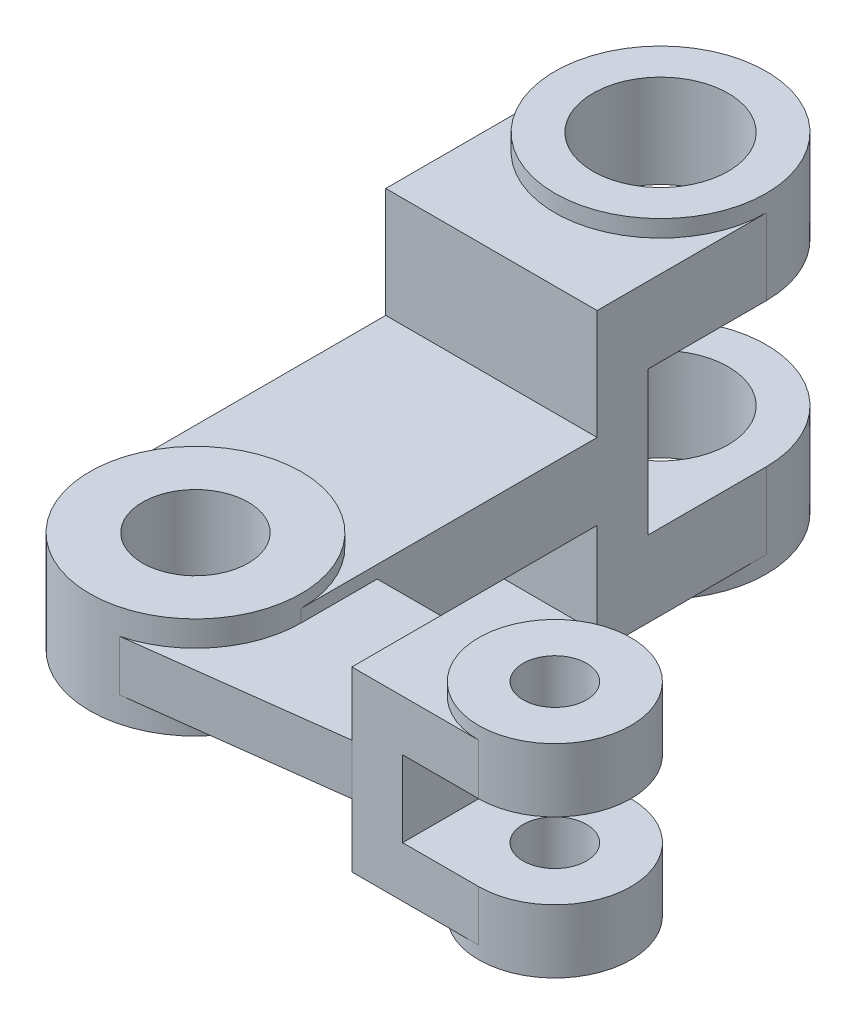
ISO-10303-21;
HEADER;
FILE_DESCRIPTION(('STEP AP214'),'2;1');
FILE_NAME('part.step','',(''),(''),'','','');
FILE_SCHEMA(('AUTOMOTIVE_DESIGN { 1 0 10303 214 1 1 1 1 }'));
ENDSEC;
DATA;
#1=APPLICATION_CONTEXT('core data for automotive mechanical design processes');
#2=APPLICATION_PROTOCOL_DEFINITION('international standard','automotive_design',2000,#1);
#3=PRODUCT_CONTEXT('',#1,'mechanical');
#4=PRODUCT('Part','Part','',(#3));
#5=PRODUCT_RELATED_PRODUCT_CATEGORY('part','',(#4));
#6=PRODUCT_DEFINITION_FORMATION('','',#4);
#7=PRODUCT_DEFINITION_CONTEXT('part definition',#1,'design');
#8=PRODUCT_DEFINITION('design','',#6,#7);
#9=PRODUCT_DEFINITION_SHAPE('','',#8);
#10=(LENGTH_UNIT() NAMED_UNIT(*) SI_UNIT(.MILLI.,.METRE.));
#11=(NAMED_UNIT(*) PLANE_ANGLE_UNIT() SI_UNIT($,.RADIAN.));
#12=(NAMED_UNIT(*) SI_UNIT($,.STERADIAN.) SOLID_ANGLE_UNIT());
#13=UNCERTAINTY_MEASURE_WITH_UNIT(LENGTH_MEASURE(1.E-05),#10,'distance_accuracy_value','');
#14=(GEOMETRIC_REPRESENTATION_CONTEXT(3) GLOBAL_UNCERTAINTY_ASSIGNED_CONTEXT((#13)) GLOBAL_UNIT_ASSIGNED_CONTEXT((#10,
#11,#12)) REPRESENTATION_CONTEXT('',''));
#15=CARTESIAN_POINT('',(0.,0.,0.));
#16=DIRECTION('',(0.,0.,1.));
#17=DIRECTION('',(1.,0.,0.));
#18=AXIS2_PLACEMENT_3D('',#15,#16,#17);
#19=CARTESIAN_POINT('',(25.,35.,40.));
#20=DIRECTION('',(0.,0.,-1.));
#21=DIRECTION('',(-1.,0.,0.));
#22=AXIS2_PLACEMENT_3D('',#19,#20,#21);
#23=PLANE('',#22);
#24=DIRECTION('',(-1.,0.,0.));
#25=VECTOR('',#24,1.);
#26=CARTESIAN_POINT('',(25.,9.,40.));
#27=LINE('',#26,#25);
#28=CARTESIAN_POINT('',(25.,9.,40.));
#29=VERTEX_POINT('',#28);
#30=CARTESIAN_POINT('',(-25.,9.,40.));
#31=VERTEX_POINT('',#30);
#32=EDGE_CURVE('E309',#29,#31,#27,.T.);
#33=ORIENTED_EDGE('',*,*,#32,.F.);
#34=DIRECTION('',(0.,-1.,0.));
#35=VECTOR('',#34,1.);
#36=CARTESIAN_POINT('',(25.,35.,40.));
#37=LINE('',#36,#35);
#38=CARTESIAN_POINT('',(25.,35.,40.));
#39=VERTEX_POINT('',#38);
#40=EDGE_CURVE('E386',#39,#29,#37,.T.);
#41=ORIENTED_EDGE('',*,*,#40,.F.);
#42=DIRECTION('',(1.,0.,0.));
#43=VECTOR('',#42,1.);
#44=CARTESIAN_POINT('',(25.,35.,40.));
#45=LINE('',#44,#43);
#46=CARTESIAN_POINT('',(-25.,35.,40.));
#47=VERTEX_POINT('',#46);
#48=EDGE_CURVE('E368',#47,#39,#45,.T.);
#49=ORIENTED_EDGE('',*,*,#48,.F.);
#50=DIRECTION('',(0.,-1.,0.));
#51=VECTOR('',#50,1.);
#52=CARTESIAN_POINT('',(-25.,35.,40.));
#53=LINE('',#52,#51);
#54=EDGE_CURVE('E390',#47,#31,#53,.T.);
#55=ORIENTED_EDGE('',*,*,#54,.T.);
#56=EDGE_LOOP('',(#33,#41,#49,#55));
#57=FACE_BOUND('',#56,.T.);
#58=ADVANCED_FACE('F39',(#57),#23,.F.);
#59=CARTESIAN_POINT('',(0.,35.,0.));
#60=DIRECTION('',(0.,-1.,0.));
#61=DIRECTION('',(0.,0.,-1.));
#62=AXIS2_PLACEMENT_3D('',#59,#60,#61);
#63=CYLINDRICAL_SURFACE('',#62,25.);
#64=CARTESIAN_POINT('',(0.,-17.,0.));
#65=DIRECTION('',(0.,-1.,0.));
#66=DIRECTION('',(0.,0.,-1.));
#67=AXIS2_PLACEMENT_3D('',#64,#65,#66);
#68=CIRCLE('',#67,25.);
#69=CARTESIAN_POINT('',(-25.,-17.,0.));
#70=VERTEX_POINT('',#69);
#71=CARTESIAN_POINT('',(25.,-17.,0.));
#72=VERTEX_POINT('',#71);
#73=EDGE_CURVE('E363',#70,#72,#68,.T.);
#74=ORIENTED_EDGE('',*,*,#73,.T.);
#75=DIRECTION('',(0.,-1.,0.));
#76=VECTOR('',#75,1.);
#77=CARTESIAN_POINT('',(25.,35.,0.));
#78=LINE('',#77,#76);
#79=CARTESIAN_POINT('',(25.,-35.,0.));
#80=VERTEX_POINT('',#79);
#81=EDGE_CURVE('E374',#72,#80,#78,.T.);
#82=ORIENTED_EDGE('',*,*,#81,.T.);
#83=CARTESIAN_POINT('',(0.,-35.,0.));
#84=DIRECTION('',(0.,1.,0.));
#85=DIRECTION('',(0.,0.,1.));
#86=AXIS2_PLACEMENT_3D('',#83,#84,#85);
#87=CIRCLE('',#86,25.);
#88=CARTESIAN_POINT('',(-25.,-35.,0.));
#89=VERTEX_POINT('',#88);
#90=EDGE_CURVE('E11',#89,#80,#87,.T.);
#91=ORIENTED_EDGE('',*,*,#90,.F.);
#92=DIRECTION('',(0.,-1.,0.));
#93=VECTOR('',#92,1.);
#94=CARTESIAN_POINT('',(-25.,35.,0.));
#95=LINE('',#94,#93);
#96=EDGE_CURVE('E391',#70,#89,#95,.T.);
#97=ORIENTED_EDGE('',*,*,#96,.F.);
#98=EDGE_LOOP('',(#74,#82,#91,#97));
#99=FACE_BOUND('',#98,.T.);
#100=CARTESIAN_POINT('',(0.,-39.,0.));
#101=DIRECTION('',(0.,1.,0.));
#102=DIRECTION('',(0.,0.,1.));
#103=AXIS2_PLACEMENT_3D('',#100,#101,#102);
#104=CIRCLE('',#103,25.);
#105=CARTESIAN_POINT('',(0.,-39.,25.));
#106=VERTEX_POINT('',#105);
#107=EDGE_CURVE('E330',#106,#106,#104,.T.);
#108=ORIENTED_EDGE('',*,*,#107,.T.);
#109=EDGE_LOOP('',(#108));
#110=FACE_BOUND('',#109,.T.);
#111=ADVANCED_FACE('F448',(#99,#110),#63,.T.);
#112=CARTESIAN_POINT('',(25.,35.,0.));
#113=VERTEX_POINT('',#112);
#114=CARTESIAN_POINT('',(25.,17.,0.));
#115=VERTEX_POINT('',#114);
#116=EDGE_CURVE('E382',#113,#115,#78,.T.);
#117=ORIENTED_EDGE('',*,*,#116,.T.);
#118=CARTESIAN_POINT('',(0.,17.,0.));
#119=DIRECTION('',(0.,1.,0.));
#120=DIRECTION('',(0.,0.,1.));
#121=AXIS2_PLACEMENT_3D('',#118,#119,#120);
#122=CIRCLE('',#121,25.);
#123=CARTESIAN_POINT('',(-25.,17.,0.));
#124=VERTEX_POINT('',#123);
#125=EDGE_CURVE('E359',#115,#124,#122,.T.);
#126=ORIENTED_EDGE('',*,*,#125,.T.);
#127=CARTESIAN_POINT('',(-25.,35.,0.));
#128=VERTEX_POINT('',#127);
#129=EDGE_CURVE('E392',#128,#124,#95,.T.);
#130=ORIENTED_EDGE('',*,*,#129,.F.);
#131=CARTESIAN_POINT('',(0.,35.,0.));
#132=DIRECTION('',(0.,1.,0.));
#133=DIRECTION('',(0.,0.,1.));
#134=AXIS2_PLACEMENT_3D('',#131,#132,#133);
#135=CIRCLE('',#134,25.);
#136=EDGE_CURVE('E48',#128,#113,#135,.T.);
#137=ORIENTED_EDGE('',*,*,#136,.T.);
#138=EDGE_LOOP('',(#117,#126,#130,#137));
#139=FACE_BOUND('',#138,.T.);
#140=CARTESIAN_POINT('',(0.,39.,0.));
#141=DIRECTION('',(0.,1.,0.));
#142=DIRECTION('',(0.,0.,1.));
#143=AXIS2_PLACEMENT_3D('',#140,#141,#142);
#144=CIRCLE('',#143,25.);
#145=CARTESIAN_POINT('',(0.,39.,25.));
#146=VERTEX_POINT('',#145);
#147=EDGE_CURVE('E336',#146,#146,#144,.T.);
#148=ORIENTED_EDGE('',*,*,#147,.F.);
#149=EDGE_LOOP('',(#148));
#150=FACE_BOUND('',#149,.T.);
#151=ADVANCED_FACE('F41',(#139,#150),#63,.T.);
#152=CARTESIAN_POINT('',(-25.,35.,40.));
#153=DIRECTION('',(1.,0.,0.));
#154=DIRECTION('',(0.,0.,-1.));
#155=AXIS2_PLACEMENT_3D('',#152,#153,#154);
#156=PLANE('',#155);
#157=DIRECTION('',(0.,-1.,0.));
#158=VECTOR('',#157,1.);
#159=CARTESIAN_POINT('',(-25.,-17.,28.));
#160=LINE('',#159,#158);
#161=CARTESIAN_POINT('',(-25.,17.,28.));
#162=VERTEX_POINT('',#161);
#163=CARTESIAN_POINT('',(-25.,-17.,28.));
#164=VERTEX_POINT('',#163);
#165=EDGE_CURVE('E350',#162,#164,#160,.T.);
#166=ORIENTED_EDGE('',*,*,#165,.T.);
#167=DIRECTION('',(0.,0.,-1.));
#168=VECTOR('',#167,1.);
#169=CARTESIAN_POINT('',(-25.,-17.,-25.));
#170=LINE('',#169,#168);
#171=EDGE_CURVE('E353',#164,#70,#170,.T.);
#172=ORIENTED_EDGE('',*,*,#171,.T.);
#173=ORIENTED_EDGE('',*,*,#96,.T.);
#174=DIRECTION('',(0.,0.,1.));
#175=VECTOR('',#174,1.);
#176=CARTESIAN_POINT('',(-25.,-35.,40.));
#177=LINE('',#176,#175);
#178=CARTESIAN_POINT('',(-25.,-35.,40.));
#179=VERTEX_POINT('',#178);
#180=EDGE_CURVE('E365',#89,#179,#177,.T.);
#181=ORIENTED_EDGE('',*,*,#180,.T.);
#182=CARTESIAN_POINT('',(-25.,-9.,40.));
#183=VERTEX_POINT('',#182);
#184=EDGE_CURVE('E389',#183,#179,#53,.T.);
#185=ORIENTED_EDGE('',*,*,#184,.F.);
#186=DIRECTION('',(0.,0.,1.));
#187=VECTOR('',#186,1.);
#188=CARTESIAN_POINT('',(-25.,-9.,40.));
#189=LINE('',#188,#187);
#190=CARTESIAN_POINT('',(-25.,-9.,110.));
#191=VERTEX_POINT('',#190);
#192=EDGE_CURVE('E310',#183,#191,#189,.T.);
#193=ORIENTED_EDGE('',*,*,#192,.T.);
#194=DIRECTION('',(0.,-1.,0.));
#195=VECTOR('',#194,1.);
#196=CARTESIAN_POINT('',(-25.,9.,110.));
#197=LINE('',#196,#195);
#198=CARTESIAN_POINT('',(-25.,9.,110.));
#199=VERTEX_POINT('',#198);
#200=EDGE_CURVE('E324',#199,#191,#197,.T.);
#201=ORIENTED_EDGE('',*,*,#200,.F.);
#202=DIRECTION('',(0.,0.,1.));
#203=VECTOR('',#202,1.);
#204=CARTESIAN_POINT('',(-25.,9.,40.));
#205=LINE('',#204,#203);
#206=EDGE_CURVE('E313',#31,#199,#205,.T.);
#207=ORIENTED_EDGE('',*,*,#206,.F.);
#208=ORIENTED_EDGE('',*,*,#54,.F.);
#209=DIRECTION('',(0.,0.,1.));
#210=VECTOR('',#209,1.);
#211=CARTESIAN_POINT('',(-25.,35.,40.));
#212=LINE('',#211,#210);
#213=EDGE_CURVE('E366',#128,#47,#212,.T.);
#214=ORIENTED_EDGE('',*,*,#213,.F.);
#215=ORIENTED_EDGE('',*,*,#129,.T.);
#216=DIRECTION('',(0.,0.,1.));
#217=VECTOR('',#216,1.);
#218=CARTESIAN_POINT('',(-25.,17.,28.));
#219=LINE('',#218,#217);
#220=EDGE_CURVE('E347',#124,#162,#219,.T.);
#221=ORIENTED_EDGE('',*,*,#220,.T.);
#222=EDGE_LOOP('',(#166,#172,#173,#181,#185,#193,#201,#207,#208,#214,#215,#221));
#223=FACE_BOUND('',#222,.T.);
#224=ADVANCED_FACE('F401',(#223),#156,.F.);
#225=CARTESIAN_POINT('',(25.,-9.,40.));
#226=VERTEX_POINT('',#225);
#227=CARTESIAN_POINT('',(25.,-35.,40.));
#228=VERTEX_POINT('',#227);
#229=EDGE_CURVE('E385',#226,#228,#37,.T.);
#230=ORIENTED_EDGE('',*,*,#229,.F.);
#231=DIRECTION('',(-1.,0.,0.));
#232=VECTOR('',#231,1.);
#233=CARTESIAN_POINT('',(25.,-9.,40.));
#234=LINE('',#233,#232);
#235=EDGE_CURVE('E318',#226,#183,#234,.T.);
#236=ORIENTED_EDGE('',*,*,#235,.T.);
#237=ORIENTED_EDGE('',*,*,#184,.T.);
#238=DIRECTION('',(1.,0.,0.));
#239=VECTOR('',#238,1.);
#240=CARTESIAN_POINT('',(25.,-35.,40.));
#241=LINE('',#240,#239);
#242=EDGE_CURVE('E377',#179,#228,#241,.T.);
#243=ORIENTED_EDGE('',*,*,#242,.T.);
#244=EDGE_LOOP('',(#230,#236,#237,#243));
#245=FACE_BOUND('',#244,.T.);
#246=ADVANCED_FACE('F411',(#245),#23,.F.);
#247=CARTESIAN_POINT('',(25.,35.,0.));
#248=DIRECTION('',(-1.,0.,0.));
#249=DIRECTION('',(0.,0.,1.));
#250=AXIS2_PLACEMENT_3D('',#247,#248,#249);
#251=PLANE('',#250);
#252=DIRECTION('',(0.,-1.,0.));
#253=VECTOR('',#252,1.);
#254=CARTESIAN_POINT('',(25.,9.,110.));
#255=LINE('',#254,#253);
#256=CARTESIAN_POINT('',(25.,9.,110.));
#257=VERTEX_POINT('',#256);
#258=CARTESIAN_POINT('',(25.,6.,110.));
#259=VERTEX_POINT('',#258);
#260=EDGE_CURVE('E322',#257,#259,#255,.T.);
#261=ORIENTED_EDGE('',*,*,#260,.T.);
#262=DIRECTION('',(0.,0.,1.));
#263=VECTOR('',#262,1.);
#264=CARTESIAN_POINT('',(25.0000000000001,6.,0.));
#265=LINE('',#264,#263);
#266=CARTESIAN_POINT('',(25.,6.,92.));
#267=VERTEX_POINT('',#266);
#268=EDGE_CURVE('E56',#267,#259,#265,.T.);
#269=ORIENTED_EDGE('',*,*,#268,.F.);
#270=DIRECTION('',(0.,-1.,0.));
#271=VECTOR('',#270,1.);
#272=CARTESIAN_POINT('',(25.,6.,92.));
#273=LINE('',#272,#271);
#274=CARTESIAN_POINT('',(25.,-6.,92.));
#275=VERTEX_POINT('',#274);
#276=EDGE_CURVE('E61',#267,#275,#273,.T.);
#277=ORIENTED_EDGE('',*,*,#276,.T.);
#278=DIRECTION('',(0.,0.,1.));
#279=VECTOR('',#278,1.);
#280=CARTESIAN_POINT('',(25.0000000000001,-6.,0.));
#281=LINE('',#280,#279);
#282=CARTESIAN_POINT('',(25.,-6.,110.));
#283=VERTEX_POINT('',#282);
#284=EDGE_CURVE('E254',#275,#283,#281,.T.);
#285=ORIENTED_EDGE('',*,*,#284,.T.);
#286=CARTESIAN_POINT('',(25.,-9.,110.));
#287=VERTEX_POINT('',#286);
#288=EDGE_CURVE('E315',#283,#287,#255,.T.);
#289=ORIENTED_EDGE('',*,*,#288,.T.);
#290=DIRECTION('',(0.,0.,-1.));
#291=VECTOR('',#290,1.);
#292=CARTESIAN_POINT('',(25.,-9.,110.));
#293=LINE('',#292,#291);
#294=EDGE_CURVE('E303',#287,#226,#293,.T.);
#295=ORIENTED_EDGE('',*,*,#294,.T.);
#296=ORIENTED_EDGE('',*,*,#229,.T.);
#297=DIRECTION('',(0.,0.,-1.));
#298=VECTOR('',#297,1.);
#299=CARTESIAN_POINT('',(25.,-35.,0.));
#300=LINE('',#299,#298);
#301=EDGE_CURVE('E369',#228,#80,#300,.T.);
#302=ORIENTED_EDGE('',*,*,#301,.T.);
#303=ORIENTED_EDGE('',*,*,#81,.F.);
#304=DIRECTION('',(0.,0.,-1.));
#305=VECTOR('',#304,1.);
#306=CARTESIAN_POINT('',(25.,-17.,-25.));
#307=LINE('',#306,#305);
#308=CARTESIAN_POINT('',(25.,-17.,28.));
#309=VERTEX_POINT('',#308);
#310=EDGE_CURVE('E344',#309,#72,#307,.T.);
#311=ORIENTED_EDGE('',*,*,#310,.F.);
#312=DIRECTION('',(0.,-1.,0.));
#313=VECTOR('',#312,1.);
#314=CARTESIAN_POINT('',(25.,-17.,28.));
#315=LINE('',#314,#313);
#316=CARTESIAN_POINT('',(25.,17.,28.));
#317=VERTEX_POINT('',#316);
#318=EDGE_CURVE('E339',#317,#309,#315,.T.);
#319=ORIENTED_EDGE('',*,*,#318,.F.);
#320=DIRECTION('',(0.,0.,-1.));
#321=VECTOR('',#320,1.);
#322=CARTESIAN_POINT('',(25.,17.,0.));
#323=LINE('',#322,#321);
#324=EDGE_CURVE('E43',#317,#115,#323,.T.);
#325=ORIENTED_EDGE('',*,*,#324,.T.);
#326=ORIENTED_EDGE('',*,*,#116,.F.);
#327=DIRECTION('',(0.,0.,-1.));
#328=VECTOR('',#327,1.);
#329=CARTESIAN_POINT('',(25.,35.,0.));
#330=LINE('',#329,#328);
#331=EDGE_CURVE('E371',#39,#113,#330,.T.);
#332=ORIENTED_EDGE('',*,*,#331,.F.);
#333=ORIENTED_EDGE('',*,*,#40,.T.);
#334=DIRECTION('',(0.,0.,-1.));
#335=VECTOR('',#334,1.);
#336=CARTESIAN_POINT('',(25.,9.,110.));
#337=LINE('',#336,#335);
#338=EDGE_CURVE('E306',#257,#29,#337,.T.);
#339=ORIENTED_EDGE('',*,*,#338,.F.);
#340=EDGE_LOOP('',(#261,#269,#277,#285,#289,#295,#296,#302,#303,#311,#319,#325,#326,#332,#333,#339));
#341=FACE_BOUND('',#340,.T.);
#342=ADVANCED_FACE('F432',(#341),#251,.F.);
#343=CARTESIAN_POINT('',(0.,35.,0.));
#344=DIRECTION('',(0.,1.,0.));
#345=DIRECTION('',(0.,0.,1.));
#346=AXIS2_PLACEMENT_3D('',#343,#344,#345);
#347=PLANE('',#346);
#348=ORIENTED_EDGE('',*,*,#136,.F.);
#349=ORIENTED_EDGE('',*,*,#213,.T.);
#350=ORIENTED_EDGE('',*,*,#48,.T.);
#351=ORIENTED_EDGE('',*,*,#331,.T.);
#352=EDGE_LOOP('',(#348,#349,#350,#351));
#353=FACE_BOUND('',#352,.T.);
#354=ADVANCED_FACE('F434',(#353),#347,.T.);
#355=CARTESIAN_POINT('',(0.,-35.,0.));
#356=DIRECTION('',(0.,1.,0.));
#357=DIRECTION('',(0.,0.,1.));
#358=AXIS2_PLACEMENT_3D('',#355,#356,#357);
#359=PLANE('',#358);
#360=ORIENTED_EDGE('',*,*,#180,.F.);
#361=ORIENTED_EDGE('',*,*,#90,.T.);
#362=ORIENTED_EDGE('',*,*,#301,.F.);
#363=ORIENTED_EDGE('',*,*,#242,.F.);
#364=EDGE_LOOP('',(#360,#361,#362,#363));
#365=FACE_BOUND('',#364,.T.);
#366=ADVANCED_FACE('F407',(#365),#359,.F.);
#367=CARTESIAN_POINT('',(-25.,-17.,-25.));
#368=DIRECTION('',(0.,-1.,0.));
#369=DIRECTION('',(0.,0.,-1.));
#370=AXIS2_PLACEMENT_3D('',#367,#368,#369);
#371=PLANE('',#370);
#372=CARTESIAN_POINT('',(0.,-17.,0.));
#373=DIRECTION('',(0.,-1.,0.));
#374=DIRECTION('',(0.,0.,-1.));
#375=AXIS2_PLACEMENT_3D('',#372,#373,#374);
#376=CIRCLE('',#375,16.);
#377=CARTESIAN_POINT('',(0.,-17.,-16.));
#378=VERTEX_POINT('',#377);
#379=EDGE_CURVE('E220',#378,#378,#376,.T.);
#380=ORIENTED_EDGE('',*,*,#379,.T.);
#381=EDGE_LOOP('',(#380));
#382=FACE_BOUND('',#381,.T.);
#383=ORIENTED_EDGE('',*,*,#73,.F.);
#384=ORIENTED_EDGE('',*,*,#171,.F.);
#385=DIRECTION('',(1.,0.,0.));
#386=VECTOR('',#385,1.);
#387=CARTESIAN_POINT('',(-25.,-17.,28.));
#388=LINE('',#387,#386);
#389=EDGE_CURVE('E357',#164,#309,#388,.T.);
#390=ORIENTED_EDGE('',*,*,#389,.T.);
#391=ORIENTED_EDGE('',*,*,#310,.T.);
#392=EDGE_LOOP('',(#383,#384,#390,#391));
#393=FACE_BOUND('',#392,.T.);
#394=ADVANCED_FACE('F446',(#382,#393),#371,.F.);
#395=CARTESIAN_POINT('',(-25.,17.,28.));
#396=DIRECTION('',(0.,1.,0.));
#397=DIRECTION('',(0.,0.,1.));
#398=AXIS2_PLACEMENT_3D('',#395,#396,#397);
#399=PLANE('',#398);
#400=CARTESIAN_POINT('',(0.,17.,0.));
#401=DIRECTION('',(0.,1.,0.));
#402=DIRECTION('',(0.,0.,1.));
#403=AXIS2_PLACEMENT_3D('',#400,#401,#402);
#404=CIRCLE('',#403,16.);
#405=CARTESIAN_POINT('',(0.,17.,16.));
#406=VERTEX_POINT('',#405);
#407=EDGE_CURVE('E853',#406,#406,#404,.T.);
#408=ORIENTED_EDGE('',*,*,#407,.T.);
#409=EDGE_LOOP('',(#408));
#410=FACE_BOUND('',#409,.T.);
#411=ORIENTED_EDGE('',*,*,#324,.F.);
#412=DIRECTION('',(1.,0.,0.));
#413=VECTOR('',#412,1.);
#414=CARTESIAN_POINT('',(-25.,17.,28.));
#415=LINE('',#414,#413);
#416=EDGE_CURVE('E356',#162,#317,#415,.T.);
#417=ORIENTED_EDGE('',*,*,#416,.F.);
#418=ORIENTED_EDGE('',*,*,#220,.F.);
#419=ORIENTED_EDGE('',*,*,#125,.F.);
#420=EDGE_LOOP('',(#411,#417,#418,#419));
#421=FACE_BOUND('',#420,.T.);
#422=ADVANCED_FACE('F439',(#410,#421),#399,.F.);
#423=CARTESIAN_POINT('',(-25.,-17.,28.));
#424=DIRECTION('',(0.,0.,1.));
#425=DIRECTION('',(1.,0.,0.));
#426=AXIS2_PLACEMENT_3D('',#423,#424,#425);
#427=PLANE('',#426);
#428=ORIENTED_EDGE('',*,*,#389,.F.);
#429=ORIENTED_EDGE('',*,*,#165,.F.);
#430=ORIENTED_EDGE('',*,*,#416,.T.);
#431=ORIENTED_EDGE('',*,*,#318,.T.);
#432=EDGE_LOOP('',(#428,#429,#430,#431));
#433=FACE_BOUND('',#432,.T.);
#434=ADVANCED_FACE('F442',(#433),#427,.F.);
#435=CARTESIAN_POINT('',(0.,39.,0.));
#436=DIRECTION('',(0.,1.,0.));
#437=DIRECTION('',(0.,0.,1.));
#438=AXIS2_PLACEMENT_3D('',#435,#436,#437);
#439=PLANE('',#438);
#440=ORIENTED_EDGE('',*,*,#147,.T.);
#441=EDGE_LOOP('',(#440));
#442=FACE_BOUND('',#441,.T.);
#443=CARTESIAN_POINT('',(0.,39.,0.));
#444=DIRECTION('',(0.,1.,0.));
#445=DIRECTION('',(0.,0.,1.));
#446=AXIS2_PLACEMENT_3D('',#443,#444,#445);
#447=CIRCLE('',#446,16.);
#448=CARTESIAN_POINT('',(0.,39.,16.));
#449=VERTEX_POINT('',#448);
#450=EDGE_CURVE('E332',#449,#449,#447,.T.);
#451=ORIENTED_EDGE('',*,*,#450,.F.);
#452=EDGE_LOOP('',(#451));
#453=FACE_BOUND('',#452,.T.);
#454=ADVANCED_FACE('F564',(#442,#453),#439,.T.);
#455=CARTESIAN_POINT('',(0.,39.,0.));
#456=DIRECTION('',(0.,-1.,0.));
#457=DIRECTION('',(0.,0.,-1.));
#458=AXIS2_PLACEMENT_3D('',#455,#456,#457);
#459=CYLINDRICAL_SURFACE('',#458,16.);
#460=ORIENTED_EDGE('',*,*,#450,.T.);
#461=EDGE_LOOP('',(#460));
#462=FACE_BOUND('',#461,.T.);
#463=ORIENTED_EDGE('',*,*,#407,.F.);
#464=EDGE_LOOP('',(#463));
#465=FACE_BOUND('',#464,.T.);
#466=ADVANCED_FACE('F566',(#462,#465),#459,.F.);
#467=CARTESIAN_POINT('',(0.,-39.,0.));
#468=DIRECTION('',(0.,-1.,0.));
#469=DIRECTION('',(0.,0.,1.));
#470=AXIS2_PLACEMENT_3D('',#467,#468,#469);
#471=PLANE('',#470);
#472=CARTESIAN_POINT('',(0.,-39.,0.));
#473=DIRECTION('',(0.,1.,0.));
#474=DIRECTION('',(0.,0.,1.));
#475=AXIS2_PLACEMENT_3D('',#472,#473,#474);
#476=CIRCLE('',#475,16.);
#477=CARTESIAN_POINT('',(0.,-39.,16.));
#478=VERTEX_POINT('',#477);
#479=EDGE_CURVE('E327',#478,#478,#476,.T.);
#480=ORIENTED_EDGE('',*,*,#479,.T.);
#481=EDGE_LOOP('',(#480));
#482=FACE_BOUND('',#481,.T.);
#483=ORIENTED_EDGE('',*,*,#107,.F.);
#484=EDGE_LOOP('',(#483));
#485=FACE_BOUND('',#484,.T.);
#486=ADVANCED_FACE('F586',(#482,#485),#471,.T.);
#487=CARTESIAN_POINT('',(0.,-39.,0.));
#488=DIRECTION('',(0.,1.,0.));
#489=DIRECTION('',(0.,0.,1.));
#490=AXIS2_PLACEMENT_3D('',#487,#488,#489);
#491=CYLINDRICAL_SURFACE('',#490,16.);
#492=ORIENTED_EDGE('',*,*,#479,.F.);
#493=EDGE_LOOP('',(#492));
#494=FACE_BOUND('',#493,.T.);
#495=ORIENTED_EDGE('',*,*,#379,.F.);
#496=EDGE_LOOP('',(#495));
#497=FACE_BOUND('',#496,.T.);
#498=ADVANCED_FACE('F588',(#494,#497),#491,.F.);
#499=CARTESIAN_POINT('',(0.,9.,110.));
#500=DIRECTION('',(0.,-1.,0.));
#501=DIRECTION('',(0.,0.,-1.));
#502=AXIS2_PLACEMENT_3D('',#499,#500,#501);
#503=CYLINDRICAL_SURFACE('',#502,25.);
#504=DIRECTION('',(0.,-1.,0.));
#505=VECTOR('',#504,1.);
#506=CARTESIAN_POINT('',(6.26219908913451,6.,134.202992843201));
#507=LINE('',#506,#505);
#508=CARTESIAN_POINT('',(6.26219908913461,6.,134.202992843201));
#509=VERTEX_POINT('',#508);
#510=CARTESIAN_POINT('',(6.26219908913461,-6.,134.202992843201));
#511=VERTEX_POINT('',#510);
#512=EDGE_CURVE('E285',#509,#511,#507,.T.);
#513=ORIENTED_EDGE('',*,*,#512,.F.);
#514=CARTESIAN_POINT('',(0.,6.,110.));
#515=DIRECTION('',(0.,1.,0.));
#516=DIRECTION('',(0.,0.,1.));
#517=AXIS2_PLACEMENT_3D('',#514,#515,#516);
#518=CIRCLE('',#517,25.);
#519=EDGE_CURVE('E261',#259,#509,#518,.F.);
#520=ORIENTED_EDGE('',*,*,#519,.F.);
#521=ORIENTED_EDGE('',*,*,#260,.F.);
#522=CARTESIAN_POINT('',(0.,9.,110.));
#523=DIRECTION('',(0.,1.,0.));
#524=DIRECTION('',(0.,0.,1.));
#525=AXIS2_PLACEMENT_3D('',#522,#523,#524);
#526=CIRCLE('',#525,25.);
#527=EDGE_CURVE('E299',#257,#199,#526,.T.);
#528=ORIENTED_EDGE('',*,*,#527,.T.);
#529=ORIENTED_EDGE('',*,*,#200,.T.);
#530=CARTESIAN_POINT('',(0.,-9.,110.));
#531=DIRECTION('',(0.,1.,0.));
#532=DIRECTION('',(0.,0.,1.));
#533=AXIS2_PLACEMENT_3D('',#530,#531,#532);
#534=CIRCLE('',#533,25.);
#535=EDGE_CURVE('E291',#287,#191,#534,.T.);
#536=ORIENTED_EDGE('',*,*,#535,.F.);
#537=ORIENTED_EDGE('',*,*,#288,.F.);
#538=CARTESIAN_POINT('',(0.,-6.,110.));
#539=DIRECTION('',(0.,1.,0.));
#540=DIRECTION('',(0.,0.,1.));
#541=AXIS2_PLACEMENT_3D('',#538,#539,#540);
#542=CIRCLE('',#541,25.);
#543=EDGE_CURVE('E274',#283,#511,#542,.F.);
#544=ORIENTED_EDGE('',*,*,#543,.T.);
#545=EDGE_LOOP('',(#513,#520,#521,#528,#529,#536,#537,#544));
#546=FACE_BOUND('',#545,.T.);
#547=CARTESIAN_POINT('',(0.,12.,110.));
#548=DIRECTION('',(0.,1.,0.));
#549=DIRECTION('',(0.,0.,1.));
#550=AXIS2_PLACEMENT_3D('',#547,#548,#549);
#551=CIRCLE('',#550,25.);
#552=CARTESIAN_POINT('',(0.,12.,135.));
#553=VERTEX_POINT('',#552);
#554=EDGE_CURVE('E300',#553,#553,#551,.T.);
#555=ORIENTED_EDGE('',*,*,#554,.F.);
#556=EDGE_LOOP('',(#555));
#557=FACE_BOUND('',#556,.T.);
#558=CARTESIAN_POINT('',(0.,-12.,110.));
#559=DIRECTION('',(0.,1.,0.));
#560=DIRECTION('',(0.,0.,1.));
#561=AXIS2_PLACEMENT_3D('',#558,#559,#560);
#562=CIRCLE('',#561,25.);
#563=CARTESIAN_POINT('',(0.,-12.,135.));
#564=VERTEX_POINT('',#563);
#565=EDGE_CURVE('E292',#564,#564,#562,.T.);
#566=ORIENTED_EDGE('',*,*,#565,.T.);
#567=EDGE_LOOP('',(#566));
#568=FACE_BOUND('',#567,.T.);
#569=ADVANCED_FACE('F420',(#546,#557,#568),#503,.T.);
#570=CARTESIAN_POINT('',(0.,9.,110.));
#571=DIRECTION('',(0.,1.,0.));
#572=DIRECTION('',(0.,0.,1.));
#573=AXIS2_PLACEMENT_3D('',#570,#571,#572);
#574=PLANE('',#573);
#575=ORIENTED_EDGE('',*,*,#206,.T.);
#576=ORIENTED_EDGE('',*,*,#527,.F.);
#577=ORIENTED_EDGE('',*,*,#338,.T.);
#578=ORIENTED_EDGE('',*,*,#32,.T.);
#579=EDGE_LOOP('',(#575,#576,#577,#578));
#580=FACE_BOUND('',#579,.T.);
#581=ADVANCED_FACE('F428',(#580),#574,.T.);
#582=CARTESIAN_POINT('',(0.,-9.,110.));
#583=DIRECTION('',(0.,1.,0.));
#584=DIRECTION('',(0.,0.,1.));
#585=AXIS2_PLACEMENT_3D('',#582,#583,#584);
#586=PLANE('',#585);
#587=ORIENTED_EDGE('',*,*,#294,.F.);
#588=ORIENTED_EDGE('',*,*,#535,.T.);
#589=ORIENTED_EDGE('',*,*,#192,.F.);
#590=ORIENTED_EDGE('',*,*,#235,.F.);
#591=EDGE_LOOP('',(#587,#588,#589,#590));
#592=FACE_BOUND('',#591,.T.);
#593=ADVANCED_FACE('F417',(#592),#586,.F.);
#594=CARTESIAN_POINT('',(0.,12.,110.));
#595=DIRECTION('',(0.,1.,0.));
#596=DIRECTION('',(0.,0.,1.));
#597=AXIS2_PLACEMENT_3D('',#594,#595,#596);
#598=PLANE('',#597);
#599=ORIENTED_EDGE('',*,*,#554,.T.);
#600=EDGE_LOOP('',(#599));
#601=FACE_BOUND('',#600,.T.);
#602=CARTESIAN_POINT('',(0.,12.,110.));
#603=DIRECTION('',(0.,1.,0.));
#604=DIRECTION('',(0.,0.,1.));
#605=AXIS2_PLACEMENT_3D('',#602,#603,#604);
#606=CIRCLE('',#605,12.5);
#607=CARTESIAN_POINT('',(0.,12.,122.5));
#608=VERTEX_POINT('',#607);
#609=EDGE_CURVE('E295',#608,#608,#606,.T.);
#610=ORIENTED_EDGE('',*,*,#609,.F.);
#611=EDGE_LOOP('',(#610));
#612=FACE_BOUND('',#611,.T.);
#613=ADVANCED_FACE('F650',(#601,#612),#598,.T.);
#614=CARTESIAN_POINT('',(0.,12.,110.));
#615=DIRECTION('',(0.,-1.,0.));
#616=DIRECTION('',(0.,0.,-1.));
#617=AXIS2_PLACEMENT_3D('',#614,#615,#616);
#618=CYLINDRICAL_SURFACE('',#617,12.5);
#619=ORIENTED_EDGE('',*,*,#609,.T.);
#620=EDGE_LOOP('',(#619));
#621=FACE_BOUND('',#620,.T.);
#622=CARTESIAN_POINT('',(0.,-12.,110.));
#623=DIRECTION('',(0.,1.,0.));
#624=DIRECTION('',(0.,0.,1.));
#625=AXIS2_PLACEMENT_3D('',#622,#623,#624);
#626=CIRCLE('',#625,12.5);
#627=CARTESIAN_POINT('',(0.,-12.,122.5));
#628=VERTEX_POINT('',#627);
#629=EDGE_CURVE('E288',#628,#628,#626,.T.);
#630=ORIENTED_EDGE('',*,*,#629,.F.);
#631=EDGE_LOOP('',(#630));
#632=FACE_BOUND('',#631,.T.);
#633=ADVANCED_FACE('F658',(#621,#632),#618,.F.);
#634=CARTESIAN_POINT('',(0.,-12.,110.));
#635=DIRECTION('',(0.,-1.,0.));
#636=DIRECTION('',(0.,0.,1.));
#637=AXIS2_PLACEMENT_3D('',#634,#635,#636);
#638=PLANE('',#637);
#639=ORIENTED_EDGE('',*,*,#629,.T.);
#640=EDGE_LOOP('',(#639));
#641=FACE_BOUND('',#640,.T.);
#642=ORIENTED_EDGE('',*,*,#565,.F.);
#643=EDGE_LOOP('',(#642));
#644=FACE_BOUND('',#643,.T.);
#645=ADVANCED_FACE('F655',(#641,#644),#638,.T.);
#646=CARTESIAN_POINT('',(16.9079375406636,6.,132.848080676643));
#647=DIRECTION('',(-0.126254279673915,0.,-0.991997911723619));
#648=DIRECTION('',(-0.991997911723619,0.,0.126254279673915));
#649=AXIS2_PLACEMENT_3D('',#646,#647,#648);
#650=PLANE('',#649);
#651=DIRECTION('',(0.991997911723619,0.,-0.126254279673915));
#652=VECTOR('',#651,1.);
#653=CARTESIAN_POINT('',(16.9079375406636,-6.,132.848080676643));
#654=LINE('',#653,#652);
#655=CARTESIAN_POINT('',(55.,-6.,128.));
#656=VERTEX_POINT('',#655);
#657=EDGE_CURVE('E276',#511,#656,#654,.T.);
#658=ORIENTED_EDGE('',*,*,#657,.T.);
#659=DIRECTION('',(0.,-1.,0.));
#660=VECTOR('',#659,1.);
#661=CARTESIAN_POINT('',(55.,6.,128.));
#662=LINE('',#661,#660);
#663=CARTESIAN_POINT('',(55.,6.,128.));
#664=VERTEX_POINT('',#663);
#665=EDGE_CURVE('E283',#664,#656,#662,.T.);
#666=ORIENTED_EDGE('',*,*,#665,.F.);
#667=DIRECTION('',(0.991997911723619,0.,-0.126254279673915));
#668=VECTOR('',#667,1.);
#669=CARTESIAN_POINT('',(16.9079375406636,6.,132.848080676643));
#670=LINE('',#669,#668);
#671=EDGE_CURVE('E265',#509,#664,#670,.T.);
#672=ORIENTED_EDGE('',*,*,#671,.F.);
#673=ORIENTED_EDGE('',*,*,#512,.T.);
#674=EDGE_LOOP('',(#658,#666,#672,#673));
#675=FACE_BOUND('',#674,.T.);
#676=ADVANCED_FACE('F459',(#675),#650,.F.);
#677=CARTESIAN_POINT('',(0.,6.,92.));
#678=DIRECTION('',(0.,0.,1.));
#679=DIRECTION('',(1.,0.,0.));
#680=AXIS2_PLACEMENT_3D('',#677,#678,#679);
#681=PLANE('',#680);
#682=DIRECTION('',(-1.,0.,0.));
#683=VECTOR('',#682,1.);
#684=CARTESIAN_POINT('',(0.,-6.,92.));
#685=LINE('',#684,#683);
#686=CARTESIAN_POINT('',(55.,-6.,92.));
#687=VERTEX_POINT('',#686);
#688=EDGE_CURVE('E262',#687,#275,#685,.T.);
#689=ORIENTED_EDGE('',*,*,#688,.T.);
#690=ORIENTED_EDGE('',*,*,#276,.F.);
#691=DIRECTION('',(-1.,0.,0.));
#692=VECTOR('',#691,1.);
#693=CARTESIAN_POINT('',(0.,6.,92.));
#694=LINE('',#693,#692);
#695=CARTESIAN_POINT('',(55.,6.,92.));
#696=VERTEX_POINT('',#695);
#697=EDGE_CURVE('E271',#696,#267,#694,.T.);
#698=ORIENTED_EDGE('',*,*,#697,.F.);
#699=DIRECTION('',(0.,-1.,0.));
#700=VECTOR('',#699,1.);
#701=CARTESIAN_POINT('',(55.,24.,92.));
#702=LINE('',#701,#700);
#703=CARTESIAN_POINT('',(55.,21.,92.));
#704=VERTEX_POINT('',#703);
#705=EDGE_CURVE('E245',#704,#696,#702,.T.);
#706=ORIENTED_EDGE('',*,*,#705,.F.);
#707=DIRECTION('',(-1.,0.,0.));
#708=VECTOR('',#707,1.);
#709=CARTESIAN_POINT('',(55.,21.,92.));
#710=LINE('',#709,#708);
#711=CARTESIAN_POINT('',(85.,21.,92.));
#712=VERTEX_POINT('',#711);
#713=EDGE_CURVE('E479',#712,#704,#710,.T.);
#714=ORIENTED_EDGE('',*,*,#713,.F.);
#715=DIRECTION('',(0.,-1.,0.));
#716=VECTOR('',#715,1.);
#717=CARTESIAN_POINT('',(85.,24.,92.));
#718=LINE('',#717,#716);
#719=CARTESIAN_POINT('',(85.,8.99999999999999,92.));
#720=VERTEX_POINT('',#719);
#721=EDGE_CURVE('E236',#712,#720,#718,.T.);
#722=ORIENTED_EDGE('',*,*,#721,.T.);
#723=DIRECTION('',(-1.,0.,0.));
#724=VECTOR('',#723,1.);
#725=CARTESIAN_POINT('',(55.,8.99999999999999,92.));
#726=LINE('',#725,#724);
#727=CARTESIAN_POINT('',(67.,8.99999999999999,92.));
#728=VERTEX_POINT('',#727);
#729=EDGE_CURVE('E496',#720,#728,#726,.T.);
#730=ORIENTED_EDGE('',*,*,#729,.T.);
#731=DIRECTION('',(0.,-1.,0.));
#732=VECTOR('',#731,1.);
#733=CARTESIAN_POINT('',(67.,24.,92.));
#734=LINE('',#733,#732);
#735=CARTESIAN_POINT('',(67.,-8.99999999999999,92.));
#736=VERTEX_POINT('',#735);
#737=EDGE_CURVE('E499',#728,#736,#734,.T.);
#738=ORIENTED_EDGE('',*,*,#737,.T.);
#739=DIRECTION('',(1.,0.,0.));
#740=VECTOR('',#739,1.);
#741=CARTESIAN_POINT('',(55.,-8.99999999999999,92.));
#742=LINE('',#741,#740);
#743=CARTESIAN_POINT('',(85.,-8.99999999999999,92.));
#744=VERTEX_POINT('',#743);
#745=EDGE_CURVE('E497',#736,#744,#742,.T.);
#746=ORIENTED_EDGE('',*,*,#745,.T.);
#747=CARTESIAN_POINT('',(85.,-21.,92.));
#748=VERTEX_POINT('',#747);
#749=EDGE_CURVE('E238',#744,#748,#718,.T.);
#750=ORIENTED_EDGE('',*,*,#749,.T.);
#751=DIRECTION('',(-1.,0.,0.));
#752=VECTOR('',#751,1.);
#753=CARTESIAN_POINT('',(55.,-21.,92.));
#754=LINE('',#753,#752);
#755=CARTESIAN_POINT('',(55.,-21.,92.));
#756=VERTEX_POINT('',#755);
#757=EDGE_CURVE('E215',#748,#756,#754,.T.);
#758=ORIENTED_EDGE('',*,*,#757,.T.);
#759=EDGE_CURVE('E244',#687,#756,#702,.T.);
#760=ORIENTED_EDGE('',*,*,#759,.F.);
#761=EDGE_LOOP('',(#689,#690,#698,#706,#714,#722,#730,#738,#746,#750,#758,#760));
#762=FACE_BOUND('',#761,.T.);
#763=ADVANCED_FACE('F466',(#762),#681,.F.);
#764=CARTESIAN_POINT('',(0.,6.,0.));
#765=DIRECTION('',(0.,1.,0.));
#766=DIRECTION('',(0.,0.,1.));
#767=AXIS2_PLACEMENT_3D('',#764,#765,#766);
#768=PLANE('',#767);
#769=ORIENTED_EDGE('',*,*,#268,.T.);
#770=ORIENTED_EDGE('',*,*,#519,.T.);
#771=ORIENTED_EDGE('',*,*,#671,.T.);
#772=DIRECTION('',(0.,0.,-1.));
#773=VECTOR('',#772,1.);
#774=CARTESIAN_POINT('',(55.,6.,0.));
#775=LINE('',#774,#773);
#776=EDGE_CURVE('E268',#664,#696,#775,.T.);
#777=ORIENTED_EDGE('',*,*,#776,.T.);
#778=ORIENTED_EDGE('',*,*,#697,.T.);
#779=EDGE_LOOP('',(#769,#770,#771,#777,#778));
#780=FACE_BOUND('',#779,.T.);
#781=ADVANCED_FACE('F462',(#780),#768,.T.);
#782=CARTESIAN_POINT('',(0.,-6.,0.));
#783=DIRECTION('',(0.,1.,0.));
#784=DIRECTION('',(0.,0.,1.));
#785=AXIS2_PLACEMENT_3D('',#782,#783,#784);
#786=PLANE('',#785);
#787=ORIENTED_EDGE('',*,*,#284,.F.);
#788=ORIENTED_EDGE('',*,*,#688,.F.);
#789=DIRECTION('',(0.,0.,-1.));
#790=VECTOR('',#789,1.);
#791=CARTESIAN_POINT('',(55.,-6.,0.));
#792=LINE('',#791,#790);
#793=EDGE_CURVE('E279',#656,#687,#792,.T.);
#794=ORIENTED_EDGE('',*,*,#793,.F.);
#795=ORIENTED_EDGE('',*,*,#657,.F.);
#796=ORIENTED_EDGE('',*,*,#543,.F.);
#797=EDGE_LOOP('',(#787,#788,#794,#795,#796));
#798=FACE_BOUND('',#797,.T.);
#799=ADVANCED_FACE('F455',(#798),#786,.F.);
#800=CARTESIAN_POINT('',(55.,24.,128.));
#801=DIRECTION('',(1.,0.,0.));
#802=DIRECTION('',(0.,0.,-1.));
#803=AXIS2_PLACEMENT_3D('',#800,#801,#802);
#804=PLANE('',#803);
#805=DIRECTION('',(0.,-1.,0.));
#806=VECTOR('',#805,1.);
#807=CARTESIAN_POINT('',(55.,24.,128.));
#808=LINE('',#807,#806);
#809=CARTESIAN_POINT('',(55.,-21.,128.));
#810=VERTEX_POINT('',#809);
#811=EDGE_CURVE('E229',#656,#810,#808,.T.);
#812=ORIENTED_EDGE('',*,*,#811,.F.);
#813=ORIENTED_EDGE('',*,*,#793,.T.);
#814=ORIENTED_EDGE('',*,*,#759,.T.);
#815=DIRECTION('',(0.,0.,1.));
#816=VECTOR('',#815,1.);
#817=CARTESIAN_POINT('',(55.,-21.,128.));
#818=LINE('',#817,#816);
#819=EDGE_CURVE('E230',#756,#810,#818,.T.);
#820=ORIENTED_EDGE('',*,*,#819,.T.);
#821=EDGE_LOOP('',(#812,#813,#814,#820));
#822=FACE_BOUND('',#821,.T.);
#823=ADVANCED_FACE('F469',(#822),#804,.F.);
#824=CARTESIAN_POINT('',(85.,-24.,110.));
#825=DIRECTION('',(0.,1.,0.));
#826=DIRECTION('',(0.,0.,1.));
#827=AXIS2_PLACEMENT_3D('',#824,#825,#826);
#828=PLANE('',#827);
#829=CARTESIAN_POINT('',(85.,-24.,110.));
#830=DIRECTION('',(0.,1.,0.));
#831=DIRECTION('',(0.,0.,1.));
#832=AXIS2_PLACEMENT_3D('',#829,#830,#831);
#833=CIRCLE('',#832,7.50000000000001);
#834=CARTESIAN_POINT('',(85.,-24.,117.5));
#835=VERTEX_POINT('',#834);
#836=EDGE_CURVE('E866',#835,#835,#833,.T.);
#837=ORIENTED_EDGE('',*,*,#836,.T.);
#838=EDGE_LOOP('',(#837));
#839=FACE_BOUND('',#838,.T.);
#840=CARTESIAN_POINT('',(85.,-24.,110.));
#841=DIRECTION('',(0.,1.,0.));
#842=DIRECTION('',(0.,0.,1.));
#843=AXIS2_PLACEMENT_3D('',#840,#841,#842);
#844=CIRCLE('',#843,18.);
#845=CARTESIAN_POINT('',(85.,-24.,128.));
#846=VERTEX_POINT('',#845);
#847=EDGE_CURVE('E508',#846,#846,#844,.T.);
#848=ORIENTED_EDGE('',*,*,#847,.F.);
#849=EDGE_LOOP('',(#848));
#850=FACE_BOUND('',#849,.T.);
#851=ADVANCED_FACE('F515',(#839,#850),#828,.F.);
#852=CARTESIAN_POINT('',(85.,24.,110.));
#853=DIRECTION('',(0.,-1.,0.));
#854=DIRECTION('',(0.,0.,-1.));
#855=AXIS2_PLACEMENT_3D('',#852,#853,#854);
#856=CYLINDRICAL_SURFACE('',#855,18.);
#857=ORIENTED_EDGE('',*,*,#721,.F.);
#858=CARTESIAN_POINT('',(85.,21.,110.));
#859=DIRECTION('',(0.,-1.,0.));
#860=DIRECTION('',(0.,0.,-1.));
#861=AXIS2_PLACEMENT_3D('',#858,#859,#860);
#862=CIRCLE('',#861,18.);
#863=CARTESIAN_POINT('',(85.0000000000001,21.,128.));
#864=VERTEX_POINT('',#863);
#865=EDGE_CURVE('E484',#864,#712,#862,.T.);
#866=ORIENTED_EDGE('',*,*,#865,.F.);
#867=DIRECTION('',(0.,-1.,0.));
#868=VECTOR('',#867,1.);
#869=CARTESIAN_POINT('',(85.,24.,128.));
#870=LINE('',#869,#868);
#871=CARTESIAN_POINT('',(85.,8.99999999999999,128.));
#872=VERTEX_POINT('',#871);
#873=EDGE_CURVE('E235',#864,#872,#870,.T.);
#874=ORIENTED_EDGE('',*,*,#873,.T.);
#875=CARTESIAN_POINT('',(85.,8.99999999999999,110.));
#876=DIRECTION('',(0.,1.,0.));
#877=DIRECTION('',(-1.,0.,0.));
#878=AXIS2_PLACEMENT_3D('',#875,#876,#877);
#879=CIRCLE('',#878,18.);
#880=EDGE_CURVE('E248',#872,#720,#879,.T.);
#881=ORIENTED_EDGE('',*,*,#880,.T.);
#882=EDGE_LOOP('',(#857,#866,#874,#881));
#883=FACE_BOUND('',#882,.T.);
#884=CARTESIAN_POINT('',(85.,24.,110.));
#885=DIRECTION('',(0.,1.,0.));
#886=DIRECTION('',(0.,0.,1.));
#887=AXIS2_PLACEMENT_3D('',#884,#885,#886);
#888=CIRCLE('',#887,18.);
#889=CARTESIAN_POINT('',(85.,24.,128.));
#890=VERTEX_POINT('',#889);
#891=EDGE_CURVE('E509',#890,#890,#888,.T.);
#892=ORIENTED_EDGE('',*,*,#891,.F.);
#893=EDGE_LOOP('',(#892));
#894=FACE_BOUND('',#893,.T.);
#895=ADVANCED_FACE('F487',(#883,#894),#856,.T.);
#896=ORIENTED_EDGE('',*,*,#776,.F.);
#897=CARTESIAN_POINT('',(55.,21.,128.));
#898=VERTEX_POINT('',#897);
#899=EDGE_CURVE('E242',#898,#664,#808,.T.);
#900=ORIENTED_EDGE('',*,*,#899,.F.);
#901=DIRECTION('',(0.,0.,1.));
#902=VECTOR('',#901,1.);
#903=CARTESIAN_POINT('',(55.,21.,128.));
#904=LINE('',#903,#902);
#905=EDGE_CURVE('E477',#704,#898,#904,.T.);
#906=ORIENTED_EDGE('',*,*,#905,.F.);
#907=ORIENTED_EDGE('',*,*,#705,.T.);
#908=EDGE_LOOP('',(#896,#900,#906,#907));
#909=FACE_BOUND('',#908,.T.);
#910=ADVANCED_FACE('F476',(#909),#804,.F.);
#911=CARTESIAN_POINT('',(85.,24.,128.));
#912=DIRECTION('',(0.,0.,-1.));
#913=DIRECTION('',(-1.,0.,0.));
#914=AXIS2_PLACEMENT_3D('',#911,#912,#913);
#915=PLANE('',#914);
#916=ORIENTED_EDGE('',*,*,#899,.T.);
#917=ORIENTED_EDGE('',*,*,#665,.T.);
#918=ORIENTED_EDGE('',*,*,#811,.T.);
#919=DIRECTION('',(1.,0.,0.));
#920=VECTOR('',#919,1.);
#921=CARTESIAN_POINT('',(85.0000000000001,-21.,128.));
#922=LINE('',#921,#920);
#923=CARTESIAN_POINT('',(85.0000000000001,-21.,128.));
#924=VERTEX_POINT('',#923);
#925=EDGE_CURVE('E212',#810,#924,#922,.T.);
#926=ORIENTED_EDGE('',*,*,#925,.T.);
#927=CARTESIAN_POINT('',(85.,-8.99999999999999,128.));
#928=VERTEX_POINT('',#927);
#929=EDGE_CURVE('E227',#928,#924,#870,.T.);
#930=ORIENTED_EDGE('',*,*,#929,.F.);
#931=DIRECTION('',(-1.,0.,0.));
#932=VECTOR('',#931,1.);
#933=CARTESIAN_POINT('',(85.,-8.99999999999999,128.));
#934=LINE('',#933,#932);
#935=CARTESIAN_POINT('',(67.,-8.99999999999999,128.));
#936=VERTEX_POINT('',#935);
#937=EDGE_CURVE('E502',#928,#936,#934,.T.);
#938=ORIENTED_EDGE('',*,*,#937,.T.);
#939=DIRECTION('',(0.,1.,0.));
#940=VECTOR('',#939,1.);
#941=CARTESIAN_POINT('',(67.,24.,128.));
#942=LINE('',#941,#940);
#943=CARTESIAN_POINT('',(67.,8.99999999999999,128.));
#944=VERTEX_POINT('',#943);
#945=EDGE_CURVE('E251',#936,#944,#942,.T.);
#946=ORIENTED_EDGE('',*,*,#945,.T.);
#947=DIRECTION('',(1.,0.,0.));
#948=VECTOR('',#947,1.);
#949=CARTESIAN_POINT('',(85.,8.99999999999999,128.));
#950=LINE('',#949,#948);
#951=EDGE_CURVE('E494',#944,#872,#950,.T.);
#952=ORIENTED_EDGE('',*,*,#951,.T.);
#953=ORIENTED_EDGE('',*,*,#873,.F.);
#954=DIRECTION('',(1.,0.,0.));
#955=VECTOR('',#954,1.);
#956=CARTESIAN_POINT('',(85.0000000000001,21.,128.));
#957=LINE('',#956,#955);
#958=EDGE_CURVE('E259',#898,#864,#957,.T.);
#959=ORIENTED_EDGE('',*,*,#958,.F.);
#960=EDGE_LOOP('',(#916,#917,#918,#926,#930,#938,#946,#952,#953,#959));
#961=FACE_BOUND('',#960,.T.);
#962=ADVANCED_FACE('F225',(#961),#915,.F.);
#963=ORIENTED_EDGE('',*,*,#847,.T.);
#964=EDGE_LOOP('',(#963));
#965=FACE_BOUND('',#964,.T.);
#966=ORIENTED_EDGE('',*,*,#749,.F.);
#967=CARTESIAN_POINT('',(85.,-8.99999999999999,110.));
#968=DIRECTION('',(0.,-1.,0.));
#969=DIRECTION('',(1.,0.,0.));
#970=AXIS2_PLACEMENT_3D('',#967,#968,#969);
#971=CIRCLE('',#970,18.);
#972=EDGE_CURVE('E234',#744,#928,#971,.T.);
#973=ORIENTED_EDGE('',*,*,#972,.T.);
#974=ORIENTED_EDGE('',*,*,#929,.T.);
#975=CARTESIAN_POINT('',(85.,-21.,110.));
#976=DIRECTION('',(0.,-1.,0.));
#977=DIRECTION('',(0.,0.,-1.));
#978=AXIS2_PLACEMENT_3D('',#975,#976,#977);
#979=CIRCLE('',#978,18.);
#980=EDGE_CURVE('E208',#924,#748,#979,.T.);
#981=ORIENTED_EDGE('',*,*,#980,.T.);
#982=EDGE_LOOP('',(#966,#973,#974,#981));
#983=FACE_BOUND('',#982,.T.);
#984=ADVANCED_FACE('F233',(#965,#983),#856,.T.);
#985=CARTESIAN_POINT('',(85.,24.,110.));
#986=DIRECTION('',(0.,1.,0.));
#987=DIRECTION('',(0.,0.,1.));
#988=AXIS2_PLACEMENT_3D('',#985,#986,#987);
#989=PLANE('',#988);
#990=ORIENTED_EDGE('',*,*,#891,.T.);
#991=EDGE_LOOP('',(#990));
#992=FACE_BOUND('',#991,.T.);
#993=CARTESIAN_POINT('',(85.,24.,110.));
#994=DIRECTION('',(0.,1.,0.));
#995=DIRECTION('',(0.,0.,1.));
#996=AXIS2_PLACEMENT_3D('',#993,#994,#995);
#997=CIRCLE('',#996,7.50000000000001);
#998=CARTESIAN_POINT('',(85.,24.,117.5));
#999=VERTEX_POINT('',#998);
#1000=EDGE_CURVE('E868',#999,#999,#997,.T.);
#1001=ORIENTED_EDGE('',*,*,#1000,.F.);
#1002=EDGE_LOOP('',(#1001));
#1003=FACE_BOUND('',#1002,.T.);
#1004=ADVANCED_FACE('F707',(#992,#1003),#989,.T.);
#1005=CARTESIAN_POINT('',(67.,8.99999999999999,-25.));
#1006=DIRECTION('',(-1.,0.,0.));
#1007=DIRECTION('',(0.,0.,1.));
#1008=AXIS2_PLACEMENT_3D('',#1005,#1006,#1007);
#1009=PLANE('',#1008);
#1010=DIRECTION('',(0.,0.,1.));
#1011=VECTOR('',#1010,1.);
#1012=CARTESIAN_POINT('',(67.,8.99999999999999,-25.));
#1013=LINE('',#1012,#1011);
#1014=EDGE_CURVE('E871',#728,#944,#1013,.T.);
#1015=ORIENTED_EDGE('',*,*,#1014,.T.);
#1016=ORIENTED_EDGE('',*,*,#945,.F.);
#1017=DIRECTION('',(0.,0.,1.));
#1018=VECTOR('',#1017,1.);
#1019=CARTESIAN_POINT('',(67.,-8.99999999999999,-25.));
#1020=LINE('',#1019,#1018);
#1021=EDGE_CURVE('E872',#736,#936,#1020,.T.);
#1022=ORIENTED_EDGE('',*,*,#1021,.F.);
#1023=ORIENTED_EDGE('',*,*,#737,.F.);
#1024=EDGE_LOOP('',(#1015,#1016,#1022,#1023));
#1025=FACE_BOUND('',#1024,.T.);
#1026=ADVANCED_FACE('F716',(#1025),#1009,.F.);
#1027=CARTESIAN_POINT('',(116.579058297088,9.,-25.));
#1028=DIRECTION('',(0.,1.,0.));
#1029=DIRECTION('',(-1.,0.,0.));
#1030=AXIS2_PLACEMENT_3D('',#1027,#1028,#1029);
#1031=PLANE('',#1030);
#1032=CARTESIAN_POINT('',(85.,8.99999999999999,110.));
#1033=DIRECTION('',(0.,1.,0.));
#1034=DIRECTION('',(-1.,0.,0.));
#1035=AXIS2_PLACEMENT_3D('',#1032,#1033,#1034);
#1036=CIRCLE('',#1035,7.50000000000001);
#1037=CARTESIAN_POINT('',(77.5,8.99999999999999,110.));
#1038=VERTEX_POINT('',#1037);
#1039=EDGE_CURVE('E258',#1038,#1038,#1036,.T.);
#1040=ORIENTED_EDGE('',*,*,#1039,.T.);
#1041=EDGE_LOOP('',(#1040));
#1042=FACE_BOUND('',#1041,.T.);
#1043=ORIENTED_EDGE('',*,*,#880,.F.);
#1044=ORIENTED_EDGE('',*,*,#951,.F.);
#1045=ORIENTED_EDGE('',*,*,#1014,.F.);
#1046=ORIENTED_EDGE('',*,*,#729,.F.);
#1047=EDGE_LOOP('',(#1043,#1044,#1045,#1046));
#1048=FACE_BOUND('',#1047,.T.);
#1049=ADVANCED_FACE('F492',(#1042,#1048),#1031,.F.);
#1050=CARTESIAN_POINT('',(67.,-8.99999999999999,-25.));
#1051=DIRECTION('',(0.,-1.,0.));
#1052=DIRECTION('',(1.,0.,0.));
#1053=AXIS2_PLACEMENT_3D('',#1050,#1051,#1052);
#1054=PLANE('',#1053);
#1055=CARTESIAN_POINT('',(85.,-8.99999999999999,110.));
#1056=DIRECTION('',(0.,-1.,0.));
#1057=DIRECTION('',(1.,0.,0.));
#1058=AXIS2_PLACEMENT_3D('',#1055,#1056,#1057);
#1059=CIRCLE('',#1058,7.50000000000001);
#1060=CARTESIAN_POINT('',(92.5,-9.,110.));
#1061=VERTEX_POINT('',#1060);
#1062=EDGE_CURVE('E255',#1061,#1061,#1059,.T.);
#1063=ORIENTED_EDGE('',*,*,#1062,.T.);
#1064=EDGE_LOOP('',(#1063));
#1065=FACE_BOUND('',#1064,.T.);
#1066=ORIENTED_EDGE('',*,*,#1021,.T.);
#1067=ORIENTED_EDGE('',*,*,#937,.F.);
#1068=ORIENTED_EDGE('',*,*,#972,.F.);
#1069=ORIENTED_EDGE('',*,*,#745,.F.);
#1070=EDGE_LOOP('',(#1066,#1067,#1068,#1069));
#1071=FACE_BOUND('',#1070,.T.);
#1072=ADVANCED_FACE('F734',(#1065,#1071),#1054,.F.);
#1073=CARTESIAN_POINT('',(85.,-39.,110.));
#1074=DIRECTION('',(0.,1.,0.));
#1075=DIRECTION('',(0.,0.,1.));
#1076=AXIS2_PLACEMENT_3D('',#1073,#1074,#1075);
#1077=CYLINDRICAL_SURFACE('',#1076,7.50000000000001);
#1078=ORIENTED_EDGE('',*,*,#1062,.F.);
#1079=EDGE_LOOP('',(#1078));
#1080=FACE_BOUND('',#1079,.T.);
#1081=ORIENTED_EDGE('',*,*,#836,.F.);
#1082=EDGE_LOOP('',(#1081));
#1083=FACE_BOUND('',#1082,.T.);
#1084=ADVANCED_FACE('F744',(#1080,#1083),#1077,.F.);
#1085=ORIENTED_EDGE('',*,*,#1000,.T.);
#1086=EDGE_LOOP('',(#1085));
#1087=FACE_BOUND('',#1086,.T.);
#1088=ORIENTED_EDGE('',*,*,#1039,.F.);
#1089=EDGE_LOOP('',(#1088));
#1090=FACE_BOUND('',#1089,.T.);
#1091=ADVANCED_FACE('F754',(#1087,#1090),#1077,.F.);
#1092=CARTESIAN_POINT('',(85.,21.,110.));
#1093=DIRECTION('',(0.,-1.,0.));
#1094=DIRECTION('',(0.,0.,-1.));
#1095=AXIS2_PLACEMENT_3D('',#1092,#1093,#1094);
#1096=PLANE('',#1095);
#1097=ORIENTED_EDGE('',*,*,#865,.T.);
#1098=ORIENTED_EDGE('',*,*,#713,.T.);
#1099=ORIENTED_EDGE('',*,*,#905,.T.);
#1100=ORIENTED_EDGE('',*,*,#958,.T.);
#1101=EDGE_LOOP('',(#1097,#1098,#1099,#1100));
#1102=FACE_BOUND('',#1101,.T.);
#1103=ADVANCED_FACE('F764',(#1102),#1096,.F.);
#1104=CARTESIAN_POINT('',(85.,-21.,110.));
#1105=DIRECTION('',(0.,1.,0.));
#1106=DIRECTION('',(0.,0.,-1.));
#1107=AXIS2_PLACEMENT_3D('',#1104,#1105,#1106);
#1108=PLANE('',#1107);
#1109=ORIENTED_EDGE('',*,*,#980,.F.);
#1110=ORIENTED_EDGE('',*,*,#925,.F.);
#1111=ORIENTED_EDGE('',*,*,#819,.F.);
#1112=ORIENTED_EDGE('',*,*,#757,.F.);
#1113=EDGE_LOOP('',(#1109,#1110,#1111,#1112));
#1114=FACE_BOUND('',#1113,.T.);
#1115=ADVANCED_FACE('F210',(#1114),#1108,.F.);
#1116=CLOSED_SHELL('',(#58,#111,#151,#224,#246,#342,#354,#366,#394,#422,#434,#454,#466,#486,
#498,#569,#581,#593,#613,#633,#645,#676,#763,#781,#799,#823,#851,#895,#910,#962,#984,#1004,
#1026,#1049,#1072,#1084,#1091,#1103,#1115));
#1117=MANIFOLD_SOLID_BREP('B2',#1116);
#1118=ADVANCED_BREP_SHAPE_REPRESENTATION('',(#18,#1117),#14);
#1119=SHAPE_DEFINITION_REPRESENTATION(#9,#1118);
ENDSEC;
END-ISO-10303-21;
